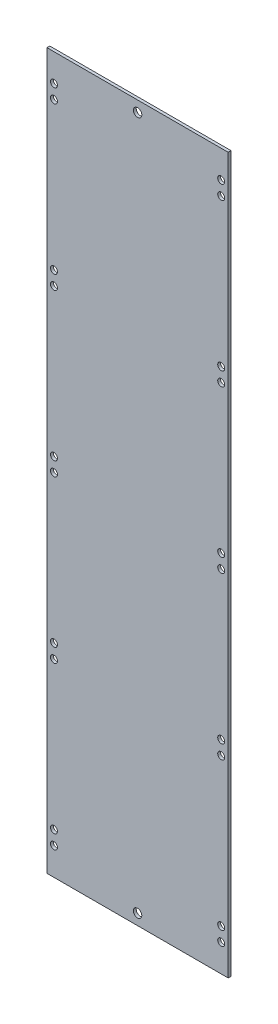
ISO-10303-21;
HEADER;
FILE_DESCRIPTION(('STEP AP214'),'2;1');
FILE_NAME('part.step','',(''),(''),'','','');
FILE_SCHEMA(('AUTOMOTIVE_DESIGN { 1 0 10303 214 1 1 1 1 }'));
ENDSEC;
DATA;
#1=APPLICATION_CONTEXT('core data for automotive mechanical design processes');
#2=APPLICATION_PROTOCOL_DEFINITION('international standard','automotive_design',2000,#1);
#3=PRODUCT_CONTEXT('',#1,'mechanical');
#4=PRODUCT('Part','Part','',(#3));
#5=PRODUCT_RELATED_PRODUCT_CATEGORY('part','',(#4));
#6=PRODUCT_DEFINITION_FORMATION('','',#4);
#7=PRODUCT_DEFINITION_CONTEXT('part definition',#1,'design');
#8=PRODUCT_DEFINITION('design','',#6,#7);
#9=PRODUCT_DEFINITION_SHAPE('','',#8);
#10=(LENGTH_UNIT() NAMED_UNIT(*) SI_UNIT(.MILLI.,.METRE.));
#11=(NAMED_UNIT(*) PLANE_ANGLE_UNIT() SI_UNIT($,.RADIAN.));
#12=(NAMED_UNIT(*) SI_UNIT($,.STERADIAN.) SOLID_ANGLE_UNIT());
#13=UNCERTAINTY_MEASURE_WITH_UNIT(LENGTH_MEASURE(1.E-05),#10,'distance_accuracy_value','');
#14=(GEOMETRIC_REPRESENTATION_CONTEXT(3) GLOBAL_UNCERTAINTY_ASSIGNED_CONTEXT((#13)) GLOBAL_UNIT_ASSIGNED_CONTEXT((#10,
#11,#12)) REPRESENTATION_CONTEXT('',''));
#15=CARTESIAN_POINT('',(0.,0.,0.));
#16=DIRECTION('',(0.,0.,1.));
#17=DIRECTION('',(1.,0.,0.));
#18=AXIS2_PLACEMENT_3D('',#15,#16,#17);
#19=CARTESIAN_POINT('',(0.,0.,1.3));
#20=DIRECTION('',(1.,0.,0.));
#21=DIRECTION('',(0.,0.,-1.));
#22=AXIS2_PLACEMENT_3D('',#19,#20,#21);
#23=PLANE('',#22);
#24=DIRECTION('',(0.,-1.,0.));
#25=VECTOR('',#24,1.);
#26=CARTESIAN_POINT('',(0.,0.,0.));
#27=LINE('',#26,#25);
#28=CARTESIAN_POINT('',(0.,327.5,0.));
#29=VERTEX_POINT('',#28);
#30=CARTESIAN_POINT('',(0.,0.,0.));
#31=VERTEX_POINT('',#30);
#32=EDGE_CURVE('E96',#29,#31,#27,.T.);
#33=ORIENTED_EDGE('',*,*,#32,.T.);
#34=DIRECTION('',(0.,0.,-1.));
#35=VECTOR('',#34,1.);
#36=CARTESIAN_POINT('',(0.,0.,1.3));
#37=LINE('',#36,#35);
#38=CARTESIAN_POINT('',(0.,0.,1.3));
#39=VERTEX_POINT('',#38);
#40=EDGE_CURVE('E11',#39,#31,#37,.T.);
#41=ORIENTED_EDGE('',*,*,#40,.F.);
#42=DIRECTION('',(0.,-1.,0.));
#43=VECTOR('',#42,1.);
#44=CARTESIAN_POINT('',(0.,0.,1.3));
#45=LINE('',#44,#43);
#46=CARTESIAN_POINT('',(0.,327.5,1.3));
#47=VERTEX_POINT('',#46);
#48=EDGE_CURVE('E84',#47,#39,#45,.T.);
#49=ORIENTED_EDGE('',*,*,#48,.F.);
#50=DIRECTION('',(0.,0.,-1.));
#51=VECTOR('',#50,1.);
#52=CARTESIAN_POINT('',(0.,327.5,1.3));
#53=LINE('',#52,#51);
#54=EDGE_CURVE('E92',#47,#29,#53,.T.);
#55=ORIENTED_EDGE('',*,*,#54,.T.);
#56=EDGE_LOOP('',(#33,#41,#49,#55));
#57=FACE_BOUND('',#56,.T.);
#58=ADVANCED_FACE('F33',(#57),#23,.F.);
#59=CARTESIAN_POINT('',(0.,0.,1.3));
#60=DIRECTION('',(0.,1.,0.));
#61=DIRECTION('',(0.,0.,1.));
#62=AXIS2_PLACEMENT_3D('',#59,#60,#61);
#63=PLANE('',#62);
#64=DIRECTION('',(1.,0.,0.));
#65=VECTOR('',#64,1.);
#66=CARTESIAN_POINT('',(0.,0.,0.));
#67=LINE('',#66,#65);
#68=CARTESIAN_POINT('',(83.,0.,0.));
#69=VERTEX_POINT('',#68);
#70=EDGE_CURVE('E88',#31,#69,#67,.T.);
#71=ORIENTED_EDGE('',*,*,#70,.T.);
#72=DIRECTION('',(0.,0.,-1.));
#73=VECTOR('',#72,1.);
#74=CARTESIAN_POINT('',(83.,0.,1.3));
#75=LINE('',#74,#73);
#76=CARTESIAN_POINT('',(83.,0.,1.3));
#77=VERTEX_POINT('',#76);
#78=EDGE_CURVE('E41',#77,#69,#75,.T.);
#79=ORIENTED_EDGE('',*,*,#78,.F.);
#80=DIRECTION('',(1.,0.,0.));
#81=VECTOR('',#80,1.);
#82=CARTESIAN_POINT('',(0.,0.,1.3));
#83=LINE('',#82,#81);
#84=EDGE_CURVE('E79',#39,#77,#83,.T.);
#85=ORIENTED_EDGE('',*,*,#84,.F.);
#86=ORIENTED_EDGE('',*,*,#40,.T.);
#87=EDGE_LOOP('',(#71,#79,#85,#86));
#88=FACE_BOUND('',#87,.T.);
#89=ADVANCED_FACE('F87',(#88),#63,.F.);
#90=CARTESIAN_POINT('',(83.,0.,1.3));
#91=DIRECTION('',(-1.,0.,0.));
#92=DIRECTION('',(0.,0.,1.));
#93=AXIS2_PLACEMENT_3D('',#90,#91,#92);
#94=PLANE('',#93);
#95=DIRECTION('',(0.,1.,0.));
#96=VECTOR('',#95,1.);
#97=CARTESIAN_POINT('',(83.,0.,0.));
#98=LINE('',#97,#96);
#99=CARTESIAN_POINT('',(83.,327.5,0.));
#100=VERTEX_POINT('',#99);
#101=EDGE_CURVE('E66',#69,#100,#98,.T.);
#102=ORIENTED_EDGE('',*,*,#101,.T.);
#103=DIRECTION('',(0.,0.,-1.));
#104=VECTOR('',#103,1.);
#105=CARTESIAN_POINT('',(83.,327.5,1.3));
#106=LINE('',#105,#104);
#107=CARTESIAN_POINT('',(83.,327.5,1.3));
#108=VERTEX_POINT('',#107);
#109=EDGE_CURVE('E89',#108,#100,#106,.T.);
#110=ORIENTED_EDGE('',*,*,#109,.F.);
#111=DIRECTION('',(0.,1.,0.));
#112=VECTOR('',#111,1.);
#113=CARTESIAN_POINT('',(83.,0.,1.3));
#114=LINE('',#113,#112);
#115=EDGE_CURVE('E82',#77,#108,#114,.T.);
#116=ORIENTED_EDGE('',*,*,#115,.F.);
#117=ORIENTED_EDGE('',*,*,#78,.T.);
#118=EDGE_LOOP('',(#102,#110,#116,#117));
#119=FACE_BOUND('',#118,.T.);
#120=ADVANCED_FACE('F90',(#119),#94,.F.);
#121=CARTESIAN_POINT('',(0.,327.5,1.3));
#122=DIRECTION('',(0.,-1.,0.));
#123=DIRECTION('',(0.,0.,-1.));
#124=AXIS2_PLACEMENT_3D('',#121,#122,#123);
#125=PLANE('',#124);
#126=DIRECTION('',(-1.,0.,0.));
#127=VECTOR('',#126,1.);
#128=CARTESIAN_POINT('',(0.,327.5,0.));
#129=LINE('',#128,#127);
#130=EDGE_CURVE('E72',#100,#29,#129,.T.);
#131=ORIENTED_EDGE('',*,*,#130,.T.);
#132=ORIENTED_EDGE('',*,*,#54,.F.);
#133=DIRECTION('',(-1.,0.,0.));
#134=VECTOR('',#133,1.);
#135=CARTESIAN_POINT('',(0.,327.5,1.3));
#136=LINE('',#135,#134);
#137=EDGE_CURVE('E49',#108,#47,#136,.T.);
#138=ORIENTED_EDGE('',*,*,#137,.F.);
#139=ORIENTED_EDGE('',*,*,#109,.T.);
#140=EDGE_LOOP('',(#131,#132,#138,#139));
#141=FACE_BOUND('',#140,.T.);
#142=ADVANCED_FACE('F104',(#141),#125,.F.);
#143=CARTESIAN_POINT('',(0.,0.,1.3));
#144=DIRECTION('',(0.,0.,-1.));
#145=DIRECTION('',(-1.,0.,0.));
#146=AXIS2_PLACEMENT_3D('',#143,#144,#145);
#147=PLANE('',#146);
#148=CARTESIAN_POINT('',(41.5,4.97599999999998,1.3));
#149=DIRECTION('',(0.,0.,1.));
#150=DIRECTION('',(1.,0.,0.));
#151=AXIS2_PLACEMENT_3D('',#148,#149,#150);
#152=CIRCLE('',#151,1.93);
#153=CARTESIAN_POINT('',(43.43,4.97599999999998,1.3));
#154=VERTEX_POINT('',#153);
#155=EDGE_CURVE('E236',#154,#154,#152,.T.);
#156=ORIENTED_EDGE('',*,*,#155,.F.);
#157=EDGE_LOOP('',(#156));
#158=FACE_BOUND('',#157,.T.);
#159=CARTESIAN_POINT('',(41.5,322.524,1.3));
#160=DIRECTION('',(0.,0.,1.));
#161=DIRECTION('',(1.,0.,0.));
#162=AXIS2_PLACEMENT_3D('',#159,#160,#161);
#163=CIRCLE('',#162,1.93);
#164=CARTESIAN_POINT('',(43.43,322.524,1.3));
#165=VERTEX_POINT('',#164);
#166=EDGE_CURVE('E230',#165,#165,#163,.T.);
#167=ORIENTED_EDGE('',*,*,#166,.F.);
#168=EDGE_LOOP('',(#167));
#169=FACE_BOUND('',#168,.T.);
#170=CARTESIAN_POINT('',(79.8000000000031,12.5999999999999,1.3));
#171=DIRECTION('',(0.,0.,1.));
#172=DIRECTION('',(1.,0.,0.));
#173=AXIS2_PLACEMENT_3D('',#170,#171,#172);
#174=CIRCLE('',#173,1.6);
#175=CARTESIAN_POINT('',(81.4000000000031,12.5999999999999,1.3));
#176=VERTEX_POINT('',#175);
#177=EDGE_CURVE('E224',#176,#176,#174,.T.);
#178=ORIENTED_EDGE('',*,*,#177,.F.);
#179=EDGE_LOOP('',(#178));
#180=FACE_BOUND('',#179,.T.);
#181=CARTESIAN_POINT('',(79.8000000000031,19.,1.3));
#182=DIRECTION('',(0.,0.,1.));
#183=DIRECTION('',(1.,0.,0.));
#184=AXIS2_PLACEMENT_3D('',#181,#182,#183);
#185=CIRCLE('',#184,1.6);
#186=CARTESIAN_POINT('',(81.4000000000031,19.,1.3));
#187=VERTEX_POINT('',#186);
#188=EDGE_CURVE('E218',#187,#187,#185,.T.);
#189=ORIENTED_EDGE('',*,*,#188,.F.);
#190=EDGE_LOOP('',(#189));
#191=FACE_BOUND('',#190,.T.);
#192=CARTESIAN_POINT('',(3.2000000000031,12.5999999999999,1.3));
#193=DIRECTION('',(0.,0.,1.));
#194=DIRECTION('',(1.,0.,0.));
#195=AXIS2_PLACEMENT_3D('',#192,#193,#194);
#196=CIRCLE('',#195,1.59999999999999);
#197=CARTESIAN_POINT('',(4.80000000000309,12.5999999999999,1.3));
#198=VERTEX_POINT('',#197);
#199=EDGE_CURVE('E212',#198,#198,#196,.T.);
#200=ORIENTED_EDGE('',*,*,#199,.F.);
#201=EDGE_LOOP('',(#200));
#202=FACE_BOUND('',#201,.T.);
#203=CARTESIAN_POINT('',(3.2000000000031,19.,1.3));
#204=DIRECTION('',(0.,0.,1.));
#205=DIRECTION('',(1.,0.,0.));
#206=AXIS2_PLACEMENT_3D('',#203,#204,#205);
#207=CIRCLE('',#206,1.59999999999999);
#208=CARTESIAN_POINT('',(4.80000000000309,19.,1.3));
#209=VERTEX_POINT('',#208);
#210=EDGE_CURVE('E206',#209,#209,#207,.T.);
#211=ORIENTED_EDGE('',*,*,#210,.F.);
#212=EDGE_LOOP('',(#211));
#213=FACE_BOUND('',#212,.T.);
#214=CARTESIAN_POINT('',(79.8000000000023,86.575,1.3));
#215=DIRECTION('',(0.,0.,1.));
#216=DIRECTION('',(1.,0.,0.));
#217=AXIS2_PLACEMENT_3D('',#214,#215,#216);
#218=CIRCLE('',#217,1.6);
#219=CARTESIAN_POINT('',(81.4000000000023,86.575,1.3));
#220=VERTEX_POINT('',#219);
#221=EDGE_CURVE('E200',#220,#220,#218,.T.);
#222=ORIENTED_EDGE('',*,*,#221,.F.);
#223=EDGE_LOOP('',(#222));
#224=FACE_BOUND('',#223,.T.);
#225=CARTESIAN_POINT('',(79.8000000000023,92.975,1.3));
#226=DIRECTION('',(0.,0.,1.));
#227=DIRECTION('',(1.,0.,0.));
#228=AXIS2_PLACEMENT_3D('',#225,#226,#227);
#229=CIRCLE('',#228,1.6);
#230=CARTESIAN_POINT('',(81.4000000000023,92.975,1.3));
#231=VERTEX_POINT('',#230);
#232=EDGE_CURVE('E194',#231,#231,#229,.T.);
#233=ORIENTED_EDGE('',*,*,#232,.F.);
#234=EDGE_LOOP('',(#233));
#235=FACE_BOUND('',#234,.T.);
#236=CARTESIAN_POINT('',(3.20000000000232,86.575,1.3));
#237=DIRECTION('',(0.,0.,1.));
#238=DIRECTION('',(1.,0.,0.));
#239=AXIS2_PLACEMENT_3D('',#236,#237,#238);
#240=CIRCLE('',#239,1.59999999999999);
#241=CARTESIAN_POINT('',(4.80000000000232,86.575,1.3));
#242=VERTEX_POINT('',#241);
#243=EDGE_CURVE('E188',#242,#242,#240,.T.);
#244=ORIENTED_EDGE('',*,*,#243,.F.);
#245=EDGE_LOOP('',(#244));
#246=FACE_BOUND('',#245,.T.);
#247=CARTESIAN_POINT('',(3.20000000000232,92.975,1.3));
#248=DIRECTION('',(0.,0.,1.));
#249=DIRECTION('',(1.,0.,0.));
#250=AXIS2_PLACEMENT_3D('',#247,#248,#249);
#251=CIRCLE('',#250,1.59999999999999);
#252=CARTESIAN_POINT('',(4.80000000000232,92.975,1.3));
#253=VERTEX_POINT('',#252);
#254=EDGE_CURVE('E182',#253,#253,#251,.T.);
#255=ORIENTED_EDGE('',*,*,#254,.F.);
#256=EDGE_LOOP('',(#255));
#257=FACE_BOUND('',#256,.T.);
#258=CARTESIAN_POINT('',(79.8000000000015,160.55,1.3));
#259=DIRECTION('',(0.,0.,1.));
#260=DIRECTION('',(1.,0.,0.));
#261=AXIS2_PLACEMENT_3D('',#258,#259,#260);
#262=CIRCLE('',#261,1.6);
#263=CARTESIAN_POINT('',(81.4000000000015,160.55,1.3));
#264=VERTEX_POINT('',#263);
#265=EDGE_CURVE('E176',#264,#264,#262,.T.);
#266=ORIENTED_EDGE('',*,*,#265,.F.);
#267=EDGE_LOOP('',(#266));
#268=FACE_BOUND('',#267,.T.);
#269=CARTESIAN_POINT('',(79.8000000000015,166.95,1.3));
#270=DIRECTION('',(0.,0.,1.));
#271=DIRECTION('',(1.,0.,0.));
#272=AXIS2_PLACEMENT_3D('',#269,#270,#271);
#273=CIRCLE('',#272,1.6);
#274=CARTESIAN_POINT('',(81.4000000000015,166.95,1.3));
#275=VERTEX_POINT('',#274);
#276=EDGE_CURVE('E170',#275,#275,#273,.T.);
#277=ORIENTED_EDGE('',*,*,#276,.F.);
#278=EDGE_LOOP('',(#277));
#279=FACE_BOUND('',#278,.T.);
#280=CARTESIAN_POINT('',(3.20000000000155,160.55,1.3));
#281=DIRECTION('',(0.,0.,1.));
#282=DIRECTION('',(1.,0.,0.));
#283=AXIS2_PLACEMENT_3D('',#280,#281,#282);
#284=CIRCLE('',#283,1.59999999999999);
#285=CARTESIAN_POINT('',(4.80000000000154,160.55,1.3));
#286=VERTEX_POINT('',#285);
#287=EDGE_CURVE('E164',#286,#286,#284,.T.);
#288=ORIENTED_EDGE('',*,*,#287,.F.);
#289=EDGE_LOOP('',(#288));
#290=FACE_BOUND('',#289,.T.);
#291=CARTESIAN_POINT('',(3.20000000000155,166.95,1.3));
#292=DIRECTION('',(0.,0.,1.));
#293=DIRECTION('',(1.,0.,0.));
#294=AXIS2_PLACEMENT_3D('',#291,#292,#293);
#295=CIRCLE('',#294,1.59999999999999);
#296=CARTESIAN_POINT('',(4.80000000000154,166.95,1.3));
#297=VERTEX_POINT('',#296);
#298=EDGE_CURVE('E158',#297,#297,#295,.T.);
#299=ORIENTED_EDGE('',*,*,#298,.F.);
#300=EDGE_LOOP('',(#299));
#301=FACE_BOUND('',#300,.T.);
#302=CARTESIAN_POINT('',(79.8000000000008,234.525,1.3));
#303=DIRECTION('',(0.,0.,1.));
#304=DIRECTION('',(1.,0.,0.));
#305=AXIS2_PLACEMENT_3D('',#302,#303,#304);
#306=CIRCLE('',#305,1.6);
#307=CARTESIAN_POINT('',(81.4000000000008,234.525,1.3));
#308=VERTEX_POINT('',#307);
#309=EDGE_CURVE('E152',#308,#308,#306,.T.);
#310=ORIENTED_EDGE('',*,*,#309,.F.);
#311=EDGE_LOOP('',(#310));
#312=FACE_BOUND('',#311,.T.);
#313=CARTESIAN_POINT('',(79.8000000000008,240.925,1.3));
#314=DIRECTION('',(0.,0.,1.));
#315=DIRECTION('',(1.,0.,0.));
#316=AXIS2_PLACEMENT_3D('',#313,#314,#315);
#317=CIRCLE('',#316,1.6);
#318=CARTESIAN_POINT('',(81.4000000000008,240.925,1.3));
#319=VERTEX_POINT('',#318);
#320=EDGE_CURVE('E146',#319,#319,#317,.T.);
#321=ORIENTED_EDGE('',*,*,#320,.F.);
#322=EDGE_LOOP('',(#321));
#323=FACE_BOUND('',#322,.T.);
#324=CARTESIAN_POINT('',(3.20000000000077,234.525,1.3));
#325=DIRECTION('',(0.,0.,1.));
#326=DIRECTION('',(1.,0.,0.));
#327=AXIS2_PLACEMENT_3D('',#324,#325,#326);
#328=CIRCLE('',#327,1.59999999999999);
#329=CARTESIAN_POINT('',(4.80000000000077,234.525,1.3));
#330=VERTEX_POINT('',#329);
#331=EDGE_CURVE('E140',#330,#330,#328,.T.);
#332=ORIENTED_EDGE('',*,*,#331,.F.);
#333=EDGE_LOOP('',(#332));
#334=FACE_BOUND('',#333,.T.);
#335=CARTESIAN_POINT('',(3.20000000000078,240.925,1.3));
#336=DIRECTION('',(0.,0.,1.));
#337=DIRECTION('',(1.,0.,0.));
#338=AXIS2_PLACEMENT_3D('',#335,#336,#337);
#339=CIRCLE('',#338,1.59999999999999);
#340=CARTESIAN_POINT('',(4.80000000000077,240.925,1.3));
#341=VERTEX_POINT('',#340);
#342=EDGE_CURVE('E134',#341,#341,#339,.T.);
#343=ORIENTED_EDGE('',*,*,#342,.F.);
#344=EDGE_LOOP('',(#343));
#345=FACE_BOUND('',#344,.T.);
#346=CARTESIAN_POINT('',(79.8,308.5,1.3));
#347=DIRECTION('',(0.,0.,1.));
#348=DIRECTION('',(1.,0.,0.));
#349=AXIS2_PLACEMENT_3D('',#346,#347,#348);
#350=CIRCLE('',#349,1.6);
#351=CARTESIAN_POINT('',(81.4,308.5,1.3));
#352=VERTEX_POINT('',#351);
#353=EDGE_CURVE('E128',#352,#352,#350,.T.);
#354=ORIENTED_EDGE('',*,*,#353,.F.);
#355=EDGE_LOOP('',(#354));
#356=FACE_BOUND('',#355,.T.);
#357=CARTESIAN_POINT('',(79.8,314.9,1.3));
#358=DIRECTION('',(0.,0.,1.));
#359=DIRECTION('',(1.,0.,0.));
#360=AXIS2_PLACEMENT_3D('',#357,#358,#359);
#361=CIRCLE('',#360,1.6);
#362=CARTESIAN_POINT('',(81.4,314.9,1.3));
#363=VERTEX_POINT('',#362);
#364=EDGE_CURVE('E122',#363,#363,#361,.T.);
#365=ORIENTED_EDGE('',*,*,#364,.F.);
#366=EDGE_LOOP('',(#365));
#367=FACE_BOUND('',#366,.T.);
#368=CARTESIAN_POINT('',(3.2,308.5,1.3));
#369=DIRECTION('',(0.,0.,1.));
#370=DIRECTION('',(1.,0.,0.));
#371=AXIS2_PLACEMENT_3D('',#368,#369,#370);
#372=CIRCLE('',#371,1.59999999999999);
#373=CARTESIAN_POINT('',(4.79999999999999,308.5,1.3));
#374=VERTEX_POINT('',#373);
#375=EDGE_CURVE('E116',#374,#374,#372,.T.);
#376=ORIENTED_EDGE('',*,*,#375,.F.);
#377=EDGE_LOOP('',(#376));
#378=FACE_BOUND('',#377,.T.);
#379=CARTESIAN_POINT('',(3.2,314.9,1.3));
#380=DIRECTION('',(0.,0.,1.));
#381=DIRECTION('',(1.,0.,0.));
#382=AXIS2_PLACEMENT_3D('',#379,#380,#381);
#383=CIRCLE('',#382,1.59999999999999);
#384=CARTESIAN_POINT('',(4.79999999999999,314.9,1.3));
#385=VERTEX_POINT('',#384);
#386=EDGE_CURVE('E110',#385,#385,#383,.T.);
#387=ORIENTED_EDGE('',*,*,#386,.F.);
#388=EDGE_LOOP('',(#387));
#389=FACE_BOUND('',#388,.T.);
#390=ORIENTED_EDGE('',*,*,#48,.T.);
#391=ORIENTED_EDGE('',*,*,#84,.T.);
#392=ORIENTED_EDGE('',*,*,#115,.T.);
#393=ORIENTED_EDGE('',*,*,#137,.T.);
#394=EDGE_LOOP('',(#390,#391,#392,#393));
#395=FACE_BOUND('',#394,.T.);
#396=ADVANCED_FACE('F80',(#158,#169,#180,#191,#202,#213,#224,#235,#246,#257,#268,#279,#290,#301,
#312,#323,#334,#345,#356,#367,#378,#389,#395),#147,.F.);
#397=CARTESIAN_POINT('',(0.,0.,0.));
#398=DIRECTION('',(0.,0.,-1.));
#399=DIRECTION('',(-1.,0.,0.));
#400=AXIS2_PLACEMENT_3D('',#397,#398,#399);
#401=PLANE('',#400);
#402=CARTESIAN_POINT('',(41.5,4.97599999999998,0.));
#403=DIRECTION('',(0.,0.,1.));
#404=DIRECTION('',(1.,0.,0.));
#405=AXIS2_PLACEMENT_3D('',#402,#403,#404);
#406=CIRCLE('',#405,1.93);
#407=CARTESIAN_POINT('',(43.43,4.97599999999998,0.));
#408=VERTEX_POINT('',#407);
#409=EDGE_CURVE('E233',#408,#408,#406,.T.);
#410=ORIENTED_EDGE('',*,*,#409,.T.);
#411=EDGE_LOOP('',(#410));
#412=FACE_BOUND('',#411,.T.);
#413=CARTESIAN_POINT('',(41.5,322.524,0.));
#414=DIRECTION('',(0.,0.,1.));
#415=DIRECTION('',(1.,0.,0.));
#416=AXIS2_PLACEMENT_3D('',#413,#414,#415);
#417=CIRCLE('',#416,1.93);
#418=CARTESIAN_POINT('',(43.43,322.524,0.));
#419=VERTEX_POINT('',#418);
#420=EDGE_CURVE('E227',#419,#419,#417,.T.);
#421=ORIENTED_EDGE('',*,*,#420,.T.);
#422=EDGE_LOOP('',(#421));
#423=FACE_BOUND('',#422,.T.);
#424=CARTESIAN_POINT('',(79.8000000000031,12.5999999999999,0.));
#425=DIRECTION('',(0.,0.,1.));
#426=DIRECTION('',(1.,0.,0.));
#427=AXIS2_PLACEMENT_3D('',#424,#425,#426);
#428=CIRCLE('',#427,1.6);
#429=CARTESIAN_POINT('',(81.4000000000031,12.5999999999999,0.));
#430=VERTEX_POINT('',#429);
#431=EDGE_CURVE('E221',#430,#430,#428,.T.);
#432=ORIENTED_EDGE('',*,*,#431,.T.);
#433=EDGE_LOOP('',(#432));
#434=FACE_BOUND('',#433,.T.);
#435=CARTESIAN_POINT('',(79.8000000000031,19.,0.));
#436=DIRECTION('',(0.,0.,1.));
#437=DIRECTION('',(1.,0.,0.));
#438=AXIS2_PLACEMENT_3D('',#435,#436,#437);
#439=CIRCLE('',#438,1.6);
#440=CARTESIAN_POINT('',(81.4000000000031,19.,0.));
#441=VERTEX_POINT('',#440);
#442=EDGE_CURVE('E215',#441,#441,#439,.T.);
#443=ORIENTED_EDGE('',*,*,#442,.T.);
#444=EDGE_LOOP('',(#443));
#445=FACE_BOUND('',#444,.T.);
#446=CARTESIAN_POINT('',(3.2000000000031,12.5999999999999,0.));
#447=DIRECTION('',(0.,0.,1.));
#448=DIRECTION('',(1.,0.,0.));
#449=AXIS2_PLACEMENT_3D('',#446,#447,#448);
#450=CIRCLE('',#449,1.59999999999999);
#451=CARTESIAN_POINT('',(4.80000000000309,12.5999999999999,0.));
#452=VERTEX_POINT('',#451);
#453=EDGE_CURVE('E209',#452,#452,#450,.T.);
#454=ORIENTED_EDGE('',*,*,#453,.T.);
#455=EDGE_LOOP('',(#454));
#456=FACE_BOUND('',#455,.T.);
#457=CARTESIAN_POINT('',(3.2000000000031,19.,0.));
#458=DIRECTION('',(0.,0.,1.));
#459=DIRECTION('',(1.,0.,0.));
#460=AXIS2_PLACEMENT_3D('',#457,#458,#459);
#461=CIRCLE('',#460,1.59999999999999);
#462=CARTESIAN_POINT('',(4.80000000000309,19.,0.));
#463=VERTEX_POINT('',#462);
#464=EDGE_CURVE('E203',#463,#463,#461,.T.);
#465=ORIENTED_EDGE('',*,*,#464,.T.);
#466=EDGE_LOOP('',(#465));
#467=FACE_BOUND('',#466,.T.);
#468=CARTESIAN_POINT('',(79.8000000000023,86.575,0.));
#469=DIRECTION('',(0.,0.,1.));
#470=DIRECTION('',(1.,0.,0.));
#471=AXIS2_PLACEMENT_3D('',#468,#469,#470);
#472=CIRCLE('',#471,1.6);
#473=CARTESIAN_POINT('',(81.4000000000023,86.575,0.));
#474=VERTEX_POINT('',#473);
#475=EDGE_CURVE('E197',#474,#474,#472,.T.);
#476=ORIENTED_EDGE('',*,*,#475,.T.);
#477=EDGE_LOOP('',(#476));
#478=FACE_BOUND('',#477,.T.);
#479=CARTESIAN_POINT('',(79.8000000000023,92.975,0.));
#480=DIRECTION('',(0.,0.,1.));
#481=DIRECTION('',(1.,0.,0.));
#482=AXIS2_PLACEMENT_3D('',#479,#480,#481);
#483=CIRCLE('',#482,1.6);
#484=CARTESIAN_POINT('',(81.4000000000023,92.975,0.));
#485=VERTEX_POINT('',#484);
#486=EDGE_CURVE('E191',#485,#485,#483,.T.);
#487=ORIENTED_EDGE('',*,*,#486,.T.);
#488=EDGE_LOOP('',(#487));
#489=FACE_BOUND('',#488,.T.);
#490=CARTESIAN_POINT('',(3.20000000000232,86.575,0.));
#491=DIRECTION('',(0.,0.,1.));
#492=DIRECTION('',(1.,0.,0.));
#493=AXIS2_PLACEMENT_3D('',#490,#491,#492);
#494=CIRCLE('',#493,1.59999999999999);
#495=CARTESIAN_POINT('',(4.80000000000232,86.575,0.));
#496=VERTEX_POINT('',#495);
#497=EDGE_CURVE('E185',#496,#496,#494,.T.);
#498=ORIENTED_EDGE('',*,*,#497,.T.);
#499=EDGE_LOOP('',(#498));
#500=FACE_BOUND('',#499,.T.);
#501=CARTESIAN_POINT('',(3.20000000000232,92.975,0.));
#502=DIRECTION('',(0.,0.,1.));
#503=DIRECTION('',(1.,0.,0.));
#504=AXIS2_PLACEMENT_3D('',#501,#502,#503);
#505=CIRCLE('',#504,1.59999999999999);
#506=CARTESIAN_POINT('',(4.80000000000232,92.975,0.));
#507=VERTEX_POINT('',#506);
#508=EDGE_CURVE('E179',#507,#507,#505,.T.);
#509=ORIENTED_EDGE('',*,*,#508,.T.);
#510=EDGE_LOOP('',(#509));
#511=FACE_BOUND('',#510,.T.);
#512=CARTESIAN_POINT('',(79.8000000000015,160.55,0.));
#513=DIRECTION('',(0.,0.,1.));
#514=DIRECTION('',(1.,0.,0.));
#515=AXIS2_PLACEMENT_3D('',#512,#513,#514);
#516=CIRCLE('',#515,1.6);
#517=CARTESIAN_POINT('',(81.4000000000015,160.55,0.));
#518=VERTEX_POINT('',#517);
#519=EDGE_CURVE('E173',#518,#518,#516,.T.);
#520=ORIENTED_EDGE('',*,*,#519,.T.);
#521=EDGE_LOOP('',(#520));
#522=FACE_BOUND('',#521,.T.);
#523=CARTESIAN_POINT('',(79.8000000000015,166.95,0.));
#524=DIRECTION('',(0.,0.,1.));
#525=DIRECTION('',(1.,0.,0.));
#526=AXIS2_PLACEMENT_3D('',#523,#524,#525);
#527=CIRCLE('',#526,1.6);
#528=CARTESIAN_POINT('',(81.4000000000015,166.95,0.));
#529=VERTEX_POINT('',#528);
#530=EDGE_CURVE('E167',#529,#529,#527,.T.);
#531=ORIENTED_EDGE('',*,*,#530,.T.);
#532=EDGE_LOOP('',(#531));
#533=FACE_BOUND('',#532,.T.);
#534=CARTESIAN_POINT('',(3.20000000000155,160.55,0.));
#535=DIRECTION('',(0.,0.,1.));
#536=DIRECTION('',(1.,0.,0.));
#537=AXIS2_PLACEMENT_3D('',#534,#535,#536);
#538=CIRCLE('',#537,1.59999999999999);
#539=CARTESIAN_POINT('',(4.80000000000154,160.55,0.));
#540=VERTEX_POINT('',#539);
#541=EDGE_CURVE('E161',#540,#540,#538,.T.);
#542=ORIENTED_EDGE('',*,*,#541,.T.);
#543=EDGE_LOOP('',(#542));
#544=FACE_BOUND('',#543,.T.);
#545=CARTESIAN_POINT('',(3.20000000000155,166.95,0.));
#546=DIRECTION('',(0.,0.,1.));
#547=DIRECTION('',(1.,0.,0.));
#548=AXIS2_PLACEMENT_3D('',#545,#546,#547);
#549=CIRCLE('',#548,1.59999999999999);
#550=CARTESIAN_POINT('',(4.80000000000154,166.95,0.));
#551=VERTEX_POINT('',#550);
#552=EDGE_CURVE('E155',#551,#551,#549,.T.);
#553=ORIENTED_EDGE('',*,*,#552,.T.);
#554=EDGE_LOOP('',(#553));
#555=FACE_BOUND('',#554,.T.);
#556=CARTESIAN_POINT('',(79.8000000000008,234.525,0.));
#557=DIRECTION('',(0.,0.,1.));
#558=DIRECTION('',(1.,0.,0.));
#559=AXIS2_PLACEMENT_3D('',#556,#557,#558);
#560=CIRCLE('',#559,1.6);
#561=CARTESIAN_POINT('',(81.4000000000008,234.525,0.));
#562=VERTEX_POINT('',#561);
#563=EDGE_CURVE('E149',#562,#562,#560,.T.);
#564=ORIENTED_EDGE('',*,*,#563,.T.);
#565=EDGE_LOOP('',(#564));
#566=FACE_BOUND('',#565,.T.);
#567=CARTESIAN_POINT('',(79.8000000000008,240.925,0.));
#568=DIRECTION('',(0.,0.,1.));
#569=DIRECTION('',(1.,0.,0.));
#570=AXIS2_PLACEMENT_3D('',#567,#568,#569);
#571=CIRCLE('',#570,1.6);
#572=CARTESIAN_POINT('',(81.4000000000008,240.925,0.));
#573=VERTEX_POINT('',#572);
#574=EDGE_CURVE('E143',#573,#573,#571,.T.);
#575=ORIENTED_EDGE('',*,*,#574,.T.);
#576=EDGE_LOOP('',(#575));
#577=FACE_BOUND('',#576,.T.);
#578=CARTESIAN_POINT('',(3.20000000000077,234.525,0.));
#579=DIRECTION('',(0.,0.,1.));
#580=DIRECTION('',(1.,0.,0.));
#581=AXIS2_PLACEMENT_3D('',#578,#579,#580);
#582=CIRCLE('',#581,1.59999999999999);
#583=CARTESIAN_POINT('',(4.80000000000077,234.525,0.));
#584=VERTEX_POINT('',#583);
#585=EDGE_CURVE('E137',#584,#584,#582,.T.);
#586=ORIENTED_EDGE('',*,*,#585,.T.);
#587=EDGE_LOOP('',(#586));
#588=FACE_BOUND('',#587,.T.);
#589=CARTESIAN_POINT('',(3.20000000000078,240.925,0.));
#590=DIRECTION('',(0.,0.,1.));
#591=DIRECTION('',(1.,0.,0.));
#592=AXIS2_PLACEMENT_3D('',#589,#590,#591);
#593=CIRCLE('',#592,1.59999999999999);
#594=CARTESIAN_POINT('',(4.80000000000077,240.925,0.));
#595=VERTEX_POINT('',#594);
#596=EDGE_CURVE('E131',#595,#595,#593,.T.);
#597=ORIENTED_EDGE('',*,*,#596,.T.);
#598=EDGE_LOOP('',(#597));
#599=FACE_BOUND('',#598,.T.);
#600=CARTESIAN_POINT('',(79.8,308.5,0.));
#601=DIRECTION('',(0.,0.,1.));
#602=DIRECTION('',(1.,0.,0.));
#603=AXIS2_PLACEMENT_3D('',#600,#601,#602);
#604=CIRCLE('',#603,1.6);
#605=CARTESIAN_POINT('',(81.4,308.5,0.));
#606=VERTEX_POINT('',#605);
#607=EDGE_CURVE('E125',#606,#606,#604,.T.);
#608=ORIENTED_EDGE('',*,*,#607,.T.);
#609=EDGE_LOOP('',(#608));
#610=FACE_BOUND('',#609,.T.);
#611=CARTESIAN_POINT('',(79.8,314.9,0.));
#612=DIRECTION('',(0.,0.,1.));
#613=DIRECTION('',(1.,0.,0.));
#614=AXIS2_PLACEMENT_3D('',#611,#612,#613);
#615=CIRCLE('',#614,1.6);
#616=CARTESIAN_POINT('',(81.4,314.9,0.));
#617=VERTEX_POINT('',#616);
#618=EDGE_CURVE('E119',#617,#617,#615,.T.);
#619=ORIENTED_EDGE('',*,*,#618,.T.);
#620=EDGE_LOOP('',(#619));
#621=FACE_BOUND('',#620,.T.);
#622=CARTESIAN_POINT('',(3.2,308.5,0.));
#623=DIRECTION('',(0.,0.,1.));
#624=DIRECTION('',(1.,0.,0.));
#625=AXIS2_PLACEMENT_3D('',#622,#623,#624);
#626=CIRCLE('',#625,1.59999999999999);
#627=CARTESIAN_POINT('',(4.79999999999999,308.5,0.));
#628=VERTEX_POINT('',#627);
#629=EDGE_CURVE('E113',#628,#628,#626,.T.);
#630=ORIENTED_EDGE('',*,*,#629,.T.);
#631=EDGE_LOOP('',(#630));
#632=FACE_BOUND('',#631,.T.);
#633=CARTESIAN_POINT('',(3.2,314.9,0.));
#634=DIRECTION('',(0.,0.,1.));
#635=DIRECTION('',(1.,0.,0.));
#636=AXIS2_PLACEMENT_3D('',#633,#634,#635);
#637=CIRCLE('',#636,1.59999999999999);
#638=CARTESIAN_POINT('',(4.79999999999999,314.9,0.));
#639=VERTEX_POINT('',#638);
#640=EDGE_CURVE('E99',#639,#639,#637,.T.);
#641=ORIENTED_EDGE('',*,*,#640,.T.);
#642=EDGE_LOOP('',(#641));
#643=FACE_BOUND('',#642,.T.);
#644=ORIENTED_EDGE('',*,*,#32,.F.);
#645=ORIENTED_EDGE('',*,*,#130,.F.);
#646=ORIENTED_EDGE('',*,*,#101,.F.);
#647=ORIENTED_EDGE('',*,*,#70,.F.);
#648=EDGE_LOOP('',(#644,#645,#646,#647));
#649=FACE_BOUND('',#648,.T.);
#650=ADVANCED_FACE('F107',(#412,#423,#434,#445,#456,#467,#478,#489,#500,#511,#522,#533,#544,
#555,#566,#577,#588,#599,#610,#621,#632,#643,#649),#401,.T.);
#651=CARTESIAN_POINT('',(3.2,314.9,0.));
#652=DIRECTION('',(0.,0.,1.));
#653=DIRECTION('',(1.,0.,0.));
#654=AXIS2_PLACEMENT_3D('',#651,#652,#653);
#655=CYLINDRICAL_SURFACE('',#654,1.59999999999999);
#656=ORIENTED_EDGE('',*,*,#640,.F.);
#657=EDGE_LOOP('',(#656));
#658=FACE_BOUND('',#657,.T.);
#659=ORIENTED_EDGE('',*,*,#386,.T.);
#660=EDGE_LOOP('',(#659));
#661=FACE_BOUND('',#660,.T.);
#662=ADVANCED_FACE('F296',(#658,#661),#655,.F.);
#663=CARTESIAN_POINT('',(3.2,308.5,0.));
#664=DIRECTION('',(0.,0.,1.));
#665=DIRECTION('',(1.,0.,0.));
#666=AXIS2_PLACEMENT_3D('',#663,#664,#665);
#667=CYLINDRICAL_SURFACE('',#666,1.59999999999999);
#668=ORIENTED_EDGE('',*,*,#629,.F.);
#669=EDGE_LOOP('',(#668));
#670=FACE_BOUND('',#669,.T.);
#671=ORIENTED_EDGE('',*,*,#375,.T.);
#672=EDGE_LOOP('',(#671));
#673=FACE_BOUND('',#672,.T.);
#674=ADVANCED_FACE('F298',(#670,#673),#667,.F.);
#675=CARTESIAN_POINT('',(79.8,314.9,0.));
#676=DIRECTION('',(0.,0.,1.));
#677=DIRECTION('',(1.,0.,0.));
#678=AXIS2_PLACEMENT_3D('',#675,#676,#677);
#679=CYLINDRICAL_SURFACE('',#678,1.6);
#680=ORIENTED_EDGE('',*,*,#618,.F.);
#681=EDGE_LOOP('',(#680));
#682=FACE_BOUND('',#681,.T.);
#683=ORIENTED_EDGE('',*,*,#364,.T.);
#684=EDGE_LOOP('',(#683));
#685=FACE_BOUND('',#684,.T.);
#686=ADVANCED_FACE('F305',(#682,#685),#679,.F.);
#687=CARTESIAN_POINT('',(79.8,308.5,0.));
#688=DIRECTION('',(0.,0.,1.));
#689=DIRECTION('',(1.,0.,0.));
#690=AXIS2_PLACEMENT_3D('',#687,#688,#689);
#691=CYLINDRICAL_SURFACE('',#690,1.6);
#692=ORIENTED_EDGE('',*,*,#607,.F.);
#693=EDGE_LOOP('',(#692));
#694=FACE_BOUND('',#693,.T.);
#695=ORIENTED_EDGE('',*,*,#353,.T.);
#696=EDGE_LOOP('',(#695));
#697=FACE_BOUND('',#696,.T.);
#698=ADVANCED_FACE('F477',(#694,#697),#691,.F.);
#699=CARTESIAN_POINT('',(3.20000000000078,240.925,0.));
#700=DIRECTION('',(0.,0.,1.));
#701=DIRECTION('',(1.,0.,0.));
#702=AXIS2_PLACEMENT_3D('',#699,#700,#701);
#703=CYLINDRICAL_SURFACE('',#702,1.59999999999999);
#704=ORIENTED_EDGE('',*,*,#596,.F.);
#705=EDGE_LOOP('',(#704));
#706=FACE_BOUND('',#705,.T.);
#707=ORIENTED_EDGE('',*,*,#342,.T.);
#708=EDGE_LOOP('',(#707));
#709=FACE_BOUND('',#708,.T.);
#710=ADVANCED_FACE('F469',(#706,#709),#703,.F.);
#711=CARTESIAN_POINT('',(3.20000000000077,234.525,0.));
#712=DIRECTION('',(0.,0.,1.));
#713=DIRECTION('',(1.,0.,0.));
#714=AXIS2_PLACEMENT_3D('',#711,#712,#713);
#715=CYLINDRICAL_SURFACE('',#714,1.59999999999999);
#716=ORIENTED_EDGE('',*,*,#585,.F.);
#717=EDGE_LOOP('',(#716));
#718=FACE_BOUND('',#717,.T.);
#719=ORIENTED_EDGE('',*,*,#331,.T.);
#720=EDGE_LOOP('',(#719));
#721=FACE_BOUND('',#720,.T.);
#722=ADVANCED_FACE('F461',(#718,#721),#715,.F.);
#723=CARTESIAN_POINT('',(79.8000000000008,240.925,0.));
#724=DIRECTION('',(0.,0.,1.));
#725=DIRECTION('',(1.,0.,0.));
#726=AXIS2_PLACEMENT_3D('',#723,#724,#725);
#727=CYLINDRICAL_SURFACE('',#726,1.6);
#728=ORIENTED_EDGE('',*,*,#574,.F.);
#729=EDGE_LOOP('',(#728));
#730=FACE_BOUND('',#729,.T.);
#731=ORIENTED_EDGE('',*,*,#320,.T.);
#732=EDGE_LOOP('',(#731));
#733=FACE_BOUND('',#732,.T.);
#734=ADVANCED_FACE('F453',(#730,#733),#727,.F.);
#735=CARTESIAN_POINT('',(79.8000000000008,234.525,0.));
#736=DIRECTION('',(0.,0.,1.));
#737=DIRECTION('',(1.,0.,0.));
#738=AXIS2_PLACEMENT_3D('',#735,#736,#737);
#739=CYLINDRICAL_SURFACE('',#738,1.6);
#740=ORIENTED_EDGE('',*,*,#563,.F.);
#741=EDGE_LOOP('',(#740));
#742=FACE_BOUND('',#741,.T.);
#743=ORIENTED_EDGE('',*,*,#309,.T.);
#744=EDGE_LOOP('',(#743));
#745=FACE_BOUND('',#744,.T.);
#746=ADVANCED_FACE('F445',(#742,#745),#739,.F.);
#747=CARTESIAN_POINT('',(3.20000000000155,166.95,0.));
#748=DIRECTION('',(0.,0.,1.));
#749=DIRECTION('',(1.,0.,0.));
#750=AXIS2_PLACEMENT_3D('',#747,#748,#749);
#751=CYLINDRICAL_SURFACE('',#750,1.59999999999999);
#752=ORIENTED_EDGE('',*,*,#552,.F.);
#753=EDGE_LOOP('',(#752));
#754=FACE_BOUND('',#753,.T.);
#755=ORIENTED_EDGE('',*,*,#298,.T.);
#756=EDGE_LOOP('',(#755));
#757=FACE_BOUND('',#756,.T.);
#758=ADVANCED_FACE('F437',(#754,#757),#751,.F.);
#759=CARTESIAN_POINT('',(3.20000000000155,160.55,0.));
#760=DIRECTION('',(0.,0.,1.));
#761=DIRECTION('',(1.,0.,0.));
#762=AXIS2_PLACEMENT_3D('',#759,#760,#761);
#763=CYLINDRICAL_SURFACE('',#762,1.59999999999999);
#764=ORIENTED_EDGE('',*,*,#541,.F.);
#765=EDGE_LOOP('',(#764));
#766=FACE_BOUND('',#765,.T.);
#767=ORIENTED_EDGE('',*,*,#287,.T.);
#768=EDGE_LOOP('',(#767));
#769=FACE_BOUND('',#768,.T.);
#770=ADVANCED_FACE('F429',(#766,#769),#763,.F.);
#771=CARTESIAN_POINT('',(79.8000000000015,166.95,0.));
#772=DIRECTION('',(0.,0.,1.));
#773=DIRECTION('',(1.,0.,0.));
#774=AXIS2_PLACEMENT_3D('',#771,#772,#773);
#775=CYLINDRICAL_SURFACE('',#774,1.6);
#776=ORIENTED_EDGE('',*,*,#530,.F.);
#777=EDGE_LOOP('',(#776));
#778=FACE_BOUND('',#777,.T.);
#779=ORIENTED_EDGE('',*,*,#276,.T.);
#780=EDGE_LOOP('',(#779));
#781=FACE_BOUND('',#780,.T.);
#782=ADVANCED_FACE('F421',(#778,#781),#775,.F.);
#783=CARTESIAN_POINT('',(79.8000000000015,160.55,0.));
#784=DIRECTION('',(0.,0.,1.));
#785=DIRECTION('',(1.,0.,0.));
#786=AXIS2_PLACEMENT_3D('',#783,#784,#785);
#787=CYLINDRICAL_SURFACE('',#786,1.6);
#788=ORIENTED_EDGE('',*,*,#519,.F.);
#789=EDGE_LOOP('',(#788));
#790=FACE_BOUND('',#789,.T.);
#791=ORIENTED_EDGE('',*,*,#265,.T.);
#792=EDGE_LOOP('',(#791));
#793=FACE_BOUND('',#792,.T.);
#794=ADVANCED_FACE('F413',(#790,#793),#787,.F.);
#795=CARTESIAN_POINT('',(3.20000000000232,92.975,0.));
#796=DIRECTION('',(0.,0.,1.));
#797=DIRECTION('',(1.,0.,0.));
#798=AXIS2_PLACEMENT_3D('',#795,#796,#797);
#799=CYLINDRICAL_SURFACE('',#798,1.59999999999999);
#800=ORIENTED_EDGE('',*,*,#508,.F.);
#801=EDGE_LOOP('',(#800));
#802=FACE_BOUND('',#801,.T.);
#803=ORIENTED_EDGE('',*,*,#254,.T.);
#804=EDGE_LOOP('',(#803));
#805=FACE_BOUND('',#804,.T.);
#806=ADVANCED_FACE('F405',(#802,#805),#799,.F.);
#807=CARTESIAN_POINT('',(3.20000000000232,86.575,0.));
#808=DIRECTION('',(0.,0.,1.));
#809=DIRECTION('',(1.,0.,0.));
#810=AXIS2_PLACEMENT_3D('',#807,#808,#809);
#811=CYLINDRICAL_SURFACE('',#810,1.59999999999999);
#812=ORIENTED_EDGE('',*,*,#497,.F.);
#813=EDGE_LOOP('',(#812));
#814=FACE_BOUND('',#813,.T.);
#815=ORIENTED_EDGE('',*,*,#243,.T.);
#816=EDGE_LOOP('',(#815));
#817=FACE_BOUND('',#816,.T.);
#818=ADVANCED_FACE('F397',(#814,#817),#811,.F.);
#819=CARTESIAN_POINT('',(79.8000000000023,92.975,0.));
#820=DIRECTION('',(0.,0.,1.));
#821=DIRECTION('',(1.,0.,0.));
#822=AXIS2_PLACEMENT_3D('',#819,#820,#821);
#823=CYLINDRICAL_SURFACE('',#822,1.6);
#824=ORIENTED_EDGE('',*,*,#486,.F.);
#825=EDGE_LOOP('',(#824));
#826=FACE_BOUND('',#825,.T.);
#827=ORIENTED_EDGE('',*,*,#232,.T.);
#828=EDGE_LOOP('',(#827));
#829=FACE_BOUND('',#828,.T.);
#830=ADVANCED_FACE('F389',(#826,#829),#823,.F.);
#831=CARTESIAN_POINT('',(79.8000000000023,86.575,0.));
#832=DIRECTION('',(0.,0.,1.));
#833=DIRECTION('',(1.,0.,0.));
#834=AXIS2_PLACEMENT_3D('',#831,#832,#833);
#835=CYLINDRICAL_SURFACE('',#834,1.6);
#836=ORIENTED_EDGE('',*,*,#475,.F.);
#837=EDGE_LOOP('',(#836));
#838=FACE_BOUND('',#837,.T.);
#839=ORIENTED_EDGE('',*,*,#221,.T.);
#840=EDGE_LOOP('',(#839));
#841=FACE_BOUND('',#840,.T.);
#842=ADVANCED_FACE('F381',(#838,#841),#835,.F.);
#843=CARTESIAN_POINT('',(3.2000000000031,19.,0.));
#844=DIRECTION('',(0.,0.,1.));
#845=DIRECTION('',(1.,0.,0.));
#846=AXIS2_PLACEMENT_3D('',#843,#844,#845);
#847=CYLINDRICAL_SURFACE('',#846,1.59999999999999);
#848=ORIENTED_EDGE('',*,*,#464,.F.);
#849=EDGE_LOOP('',(#848));
#850=FACE_BOUND('',#849,.T.);
#851=ORIENTED_EDGE('',*,*,#210,.T.);
#852=EDGE_LOOP('',(#851));
#853=FACE_BOUND('',#852,.T.);
#854=ADVANCED_FACE('F373',(#850,#853),#847,.F.);
#855=CARTESIAN_POINT('',(3.2000000000031,12.5999999999999,0.));
#856=DIRECTION('',(0.,0.,1.));
#857=DIRECTION('',(1.,0.,0.));
#858=AXIS2_PLACEMENT_3D('',#855,#856,#857);
#859=CYLINDRICAL_SURFACE('',#858,1.59999999999999);
#860=ORIENTED_EDGE('',*,*,#453,.F.);
#861=EDGE_LOOP('',(#860));
#862=FACE_BOUND('',#861,.T.);
#863=ORIENTED_EDGE('',*,*,#199,.T.);
#864=EDGE_LOOP('',(#863));
#865=FACE_BOUND('',#864,.T.);
#866=ADVANCED_FACE('F365',(#862,#865),#859,.F.);
#867=CARTESIAN_POINT('',(79.8000000000031,19.,0.));
#868=DIRECTION('',(0.,0.,1.));
#869=DIRECTION('',(1.,0.,0.));
#870=AXIS2_PLACEMENT_3D('',#867,#868,#869);
#871=CYLINDRICAL_SURFACE('',#870,1.6);
#872=ORIENTED_EDGE('',*,*,#442,.F.);
#873=EDGE_LOOP('',(#872));
#874=FACE_BOUND('',#873,.T.);
#875=ORIENTED_EDGE('',*,*,#188,.T.);
#876=EDGE_LOOP('',(#875));
#877=FACE_BOUND('',#876,.T.);
#878=ADVANCED_FACE('F358',(#874,#877),#871,.F.);
#879=CARTESIAN_POINT('',(79.8000000000031,12.5999999999999,0.));
#880=DIRECTION('',(0.,0.,1.));
#881=DIRECTION('',(1.,0.,0.));
#882=AXIS2_PLACEMENT_3D('',#879,#880,#881);
#883=CYLINDRICAL_SURFACE('',#882,1.6);
#884=ORIENTED_EDGE('',*,*,#431,.F.);
#885=EDGE_LOOP('',(#884));
#886=FACE_BOUND('',#885,.T.);
#887=ORIENTED_EDGE('',*,*,#177,.T.);
#888=EDGE_LOOP('',(#887));
#889=FACE_BOUND('',#888,.T.);
#890=ADVANCED_FACE('F343',(#886,#889),#883,.F.);
#891=CARTESIAN_POINT('',(41.5,322.524,0.));
#892=DIRECTION('',(0.,0.,1.));
#893=DIRECTION('',(1.,0.,0.));
#894=AXIS2_PLACEMENT_3D('',#891,#892,#893);
#895=CYLINDRICAL_SURFACE('',#894,1.93);
#896=ORIENTED_EDGE('',*,*,#420,.F.);
#897=EDGE_LOOP('',(#896));
#898=FACE_BOUND('',#897,.T.);
#899=ORIENTED_EDGE('',*,*,#166,.T.);
#900=EDGE_LOOP('',(#899));
#901=FACE_BOUND('',#900,.T.);
#902=ADVANCED_FACE('F247',(#898,#901),#895,.F.);
#903=CARTESIAN_POINT('',(41.5,4.97599999999998,0.));
#904=DIRECTION('',(0.,0.,1.));
#905=DIRECTION('',(1.,0.,0.));
#906=AXIS2_PLACEMENT_3D('',#903,#904,#905);
#907=CYLINDRICAL_SURFACE('',#906,1.93);
#908=ORIENTED_EDGE('',*,*,#409,.F.);
#909=EDGE_LOOP('',(#908));
#910=FACE_BOUND('',#909,.T.);
#911=ORIENTED_EDGE('',*,*,#155,.T.);
#912=EDGE_LOOP('',(#911));
#913=FACE_BOUND('',#912,.T.);
#914=ADVANCED_FACE('F244',(#910,#913),#907,.F.);
#915=CLOSED_SHELL('',(#58,#89,#120,#142,#396,#650,#662,#674,#686,#698,#710,#722,#734,#746,#758,
#770,#782,#794,#806,#818,#830,#842,#854,#866,#878,#890,#902,#914));
#916=MANIFOLD_SOLID_BREP('B2',#915);
#917=ADVANCED_BREP_SHAPE_REPRESENTATION('',(#18,#916),#14);
#918=SHAPE_DEFINITION_REPRESENTATION(#9,#917);
ENDSEC;
END-ISO-10303-21;
